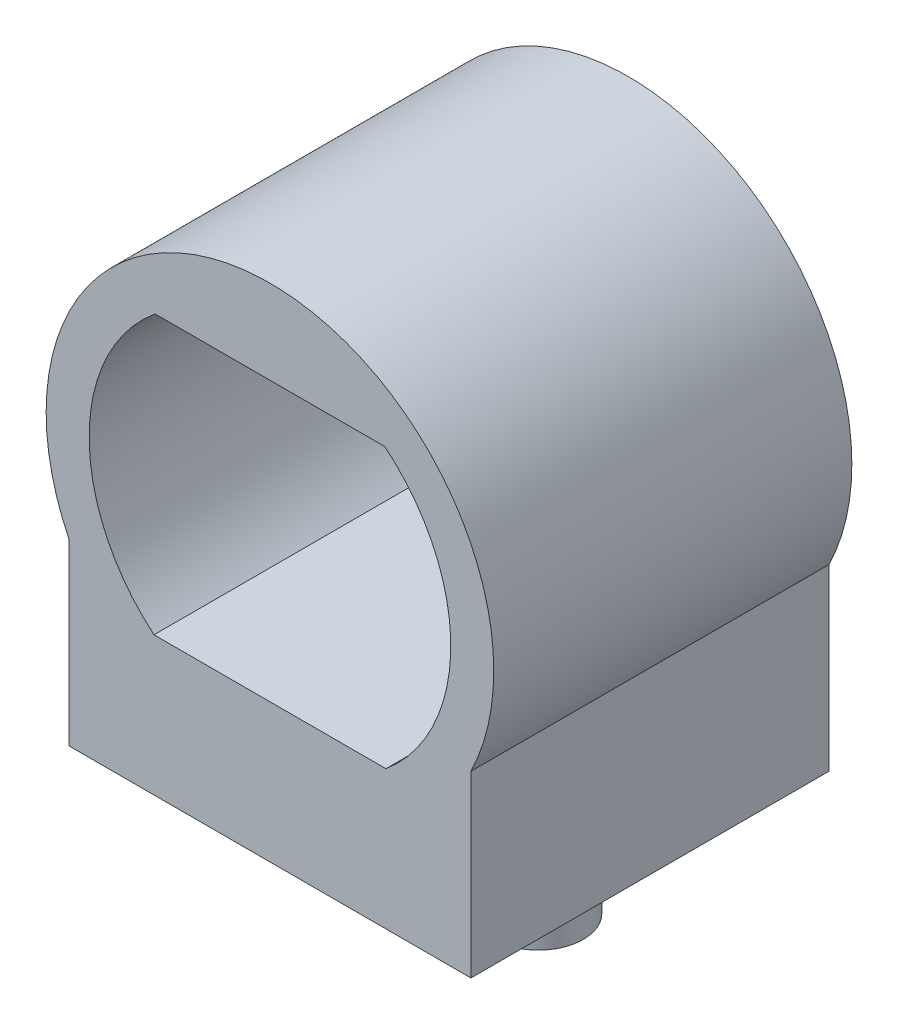
ISO-10303-21;
HEADER;
FILE_DESCRIPTION(('STEP AP214'),'2;1');
FILE_NAME('part.step','',(''),(''),'','','');
FILE_SCHEMA(('AUTOMOTIVE_DESIGN { 1 0 10303 214 1 1 1 1 }'));
ENDSEC;
DATA;
#1=APPLICATION_CONTEXT('core data for automotive mechanical design processes');
#2=APPLICATION_PROTOCOL_DEFINITION('international standard','automotive_design',2000,#1);
#3=PRODUCT_CONTEXT('',#1,'mechanical');
#4=PRODUCT('Part','Part','',(#3));
#5=PRODUCT_RELATED_PRODUCT_CATEGORY('part','',(#4));
#6=PRODUCT_DEFINITION_FORMATION('','',#4);
#7=PRODUCT_DEFINITION_CONTEXT('part definition',#1,'design');
#8=PRODUCT_DEFINITION('design','',#6,#7);
#9=PRODUCT_DEFINITION_SHAPE('','',#8);
#10=(LENGTH_UNIT() NAMED_UNIT(*) SI_UNIT(.MILLI.,.METRE.));
#11=(NAMED_UNIT(*) PLANE_ANGLE_UNIT() SI_UNIT($,.RADIAN.));
#12=(NAMED_UNIT(*) SI_UNIT($,.STERADIAN.) SOLID_ANGLE_UNIT());
#13=UNCERTAINTY_MEASURE_WITH_UNIT(LENGTH_MEASURE(1.E-05),#10,'distance_accuracy_value','');
#14=(GEOMETRIC_REPRESENTATION_CONTEXT(3) GLOBAL_UNCERTAINTY_ASSIGNED_CONTEXT((#13)) GLOBAL_UNIT_ASSIGNED_CONTEXT((#10,
#11,#12)) REPRESENTATION_CONTEXT('',''));
#15=CARTESIAN_POINT('',(0.,0.,0.));
#16=DIRECTION('',(0.,0.,1.));
#17=DIRECTION('',(1.,0.,0.));
#18=AXIS2_PLACEMENT_3D('',#15,#16,#17);
#19=CARTESIAN_POINT('',(0.,0.,0.));
#20=DIRECTION('',(0.,0.,1.));
#21=DIRECTION('',(1.,0.,0.));
#22=AXIS2_PLACEMENT_3D('',#19,#20,#21);
#23=PLANE('',#22);
#24=CARTESIAN_POINT('',(0.,0.,0.));
#25=DIRECTION('',(0.,0.,1.));
#26=DIRECTION('',(1.,0.,0.));
#27=AXIS2_PLACEMENT_3D('',#24,#25,#26);
#28=CIRCLE('',#27,10.1);
#29=CARTESIAN_POINT('',(6.47668896890996,-7.75,0.));
#30=VERTEX_POINT('',#29);
#31=CARTESIAN_POINT('',(6.41638527521533,7.8,0.));
#32=VERTEX_POINT('',#31);
#33=EDGE_CURVE('E67',#30,#32,#28,.T.);
#34=ORIENTED_EDGE('',*,*,#33,.F.);
#35=DIRECTION('',(1.,0.,0.));
#36=VECTOR('',#35,1.);
#37=CARTESIAN_POINT('',(0.,-7.75,0.));
#38=LINE('',#37,#36);
#39=CARTESIAN_POINT('',(-6.47668896890996,-7.75,0.));
#40=VERTEX_POINT('',#39);
#41=EDGE_CURVE('E125',#40,#30,#38,.T.);
#42=ORIENTED_EDGE('',*,*,#41,.F.);
#43=CARTESIAN_POINT('',(-6.41638527521533,7.8,0.));
#44=VERTEX_POINT('',#43);
#45=EDGE_CURVE('E145',#44,#40,#28,.T.);
#46=ORIENTED_EDGE('',*,*,#45,.F.);
#47=DIRECTION('',(-1.,0.,0.));
#48=VECTOR('',#47,1.);
#49=CARTESIAN_POINT('',(0.,7.8,0.));
#50=LINE('',#49,#48);
#51=EDGE_CURVE('E143',#32,#44,#50,.T.);
#52=ORIENTED_EDGE('',*,*,#51,.F.);
#53=EDGE_LOOP('',(#34,#42,#46,#52));
#54=FACE_BOUND('',#53,.T.);
#55=CARTESIAN_POINT('',(0.,0.,0.));
#56=DIRECTION('',(0.,0.,1.));
#57=DIRECTION('',(1.,0.,0.));
#58=AXIS2_PLACEMENT_3D('',#55,#56,#57);
#59=CIRCLE('',#58,12.5);
#60=CARTESIAN_POINT('',(11.2249721603218,-5.5,0.));
#61=VERTEX_POINT('',#60);
#62=CARTESIAN_POINT('',(-11.2249721603218,-5.5,0.));
#63=VERTEX_POINT('',#62);
#64=EDGE_CURVE('E132',#61,#63,#59,.T.);
#65=ORIENTED_EDGE('',*,*,#64,.T.);
#66=DIRECTION('',(0.,-1.,0.));
#67=VECTOR('',#66,1.);
#68=CARTESIAN_POINT('',(-11.2249721603218,0.,0.));
#69=LINE('',#68,#67);
#70=CARTESIAN_POINT('',(-11.2249721603218,-15.5,0.));
#71=VERTEX_POINT('',#70);
#72=EDGE_CURVE('E180',#63,#71,#69,.T.);
#73=ORIENTED_EDGE('',*,*,#72,.T.);
#74=DIRECTION('',(1.,0.,0.));
#75=VECTOR('',#74,1.);
#76=CARTESIAN_POINT('',(0.,-15.5,0.));
#77=LINE('',#76,#75);
#78=CARTESIAN_POINT('',(11.2249721603218,-15.5,0.));
#79=VERTEX_POINT('',#78);
#80=EDGE_CURVE('E184',#71,#79,#77,.T.);
#81=ORIENTED_EDGE('',*,*,#80,.T.);
#82=DIRECTION('',(0.,-1.,0.));
#83=VECTOR('',#82,1.);
#84=CARTESIAN_POINT('',(11.2249721603218,0.,0.));
#85=LINE('',#84,#83);
#86=EDGE_CURVE('E166',#61,#79,#85,.T.);
#87=ORIENTED_EDGE('',*,*,#86,.F.);
#88=EDGE_LOOP('',(#65,#73,#81,#87));
#89=FACE_BOUND('',#88,.T.);
#90=ADVANCED_FACE('F49',(#54,#89),#23,.T.);
#91=CARTESIAN_POINT('',(0.,0.,-20.));
#92=DIRECTION('',(0.,0.,1.));
#93=DIRECTION('',(1.,0.,0.));
#94=AXIS2_PLACEMENT_3D('',#91,#92,#93);
#95=CYLINDRICAL_SURFACE('',#94,12.5);
#96=ORIENTED_EDGE('',*,*,#64,.F.);
#97=DIRECTION('',(0.,0.,1.));
#98=VECTOR('',#97,1.);
#99=CARTESIAN_POINT('',(11.2249721603218,-5.5,-20.));
#100=LINE('',#99,#98);
#101=CARTESIAN_POINT('',(11.2249721603218,-5.5,-20.));
#102=VERTEX_POINT('',#101);
#103=EDGE_CURVE('E11',#102,#61,#100,.T.);
#104=ORIENTED_EDGE('',*,*,#103,.F.);
#105=CARTESIAN_POINT('',(0.,0.,-20.));
#106=DIRECTION('',(0.,0.,1.));
#107=DIRECTION('',(1.,0.,0.));
#108=AXIS2_PLACEMENT_3D('',#105,#106,#107);
#109=CIRCLE('',#108,12.5);
#110=CARTESIAN_POINT('',(-11.2249721603218,-5.5,-20.));
#111=VERTEX_POINT('',#110);
#112=EDGE_CURVE('E161',#102,#111,#109,.T.);
#113=ORIENTED_EDGE('',*,*,#112,.T.);
#114=DIRECTION('',(0.,0.,1.));
#115=VECTOR('',#114,1.);
#116=CARTESIAN_POINT('',(-11.2249721603218,-5.5,-20.));
#117=LINE('',#116,#115);
#118=EDGE_CURVE('E53',#111,#63,#117,.T.);
#119=ORIENTED_EDGE('',*,*,#118,.T.);
#120=EDGE_LOOP('',(#96,#104,#113,#119));
#121=FACE_BOUND('',#120,.T.);
#122=ADVANCED_FACE('F51',(#121),#95,.T.);
#123=CARTESIAN_POINT('',(11.2249721603218,0.,-20.));
#124=DIRECTION('',(-1.,0.,0.));
#125=DIRECTION('',(0.,-1.,0.));
#126=AXIS2_PLACEMENT_3D('',#123,#124,#125);
#127=PLANE('',#126);
#128=ORIENTED_EDGE('',*,*,#86,.T.);
#129=DIRECTION('',(0.,0.,1.));
#130=VECTOR('',#129,1.);
#131=CARTESIAN_POINT('',(11.2249721603218,-15.5,-20.));
#132=LINE('',#131,#130);
#133=CARTESIAN_POINT('',(11.2249721603218,-15.5,-20.));
#134=VERTEX_POINT('',#133);
#135=EDGE_CURVE('E59',#134,#79,#132,.T.);
#136=ORIENTED_EDGE('',*,*,#135,.F.);
#137=DIRECTION('',(0.,-1.,0.));
#138=VECTOR('',#137,1.);
#139=CARTESIAN_POINT('',(11.2249721603218,0.,-20.));
#140=LINE('',#139,#138);
#141=EDGE_CURVE('E174',#102,#134,#140,.T.);
#142=ORIENTED_EDGE('',*,*,#141,.F.);
#143=ORIENTED_EDGE('',*,*,#103,.T.);
#144=EDGE_LOOP('',(#128,#136,#142,#143));
#145=FACE_BOUND('',#144,.T.);
#146=ADVANCED_FACE('F207',(#145),#127,.F.);
#147=CARTESIAN_POINT('',(0.,-15.5,-20.));
#148=DIRECTION('',(0.,-1.,0.));
#149=DIRECTION('',(0.,0.,-1.));
#150=AXIS2_PLACEMENT_3D('',#147,#148,#149);
#151=PLANE('',#150);
#152=CARTESIAN_POINT('',(5.,-15.5,-10.));
#153=DIRECTION('',(0.,-1.,0.));
#154=DIRECTION('',(0.,0.,1.));
#155=AXIS2_PLACEMENT_3D('',#152,#153,#154);
#156=CIRCLE('',#155,2.5);
#157=CARTESIAN_POINT('',(5.,-15.5,-7.5));
#158=VERTEX_POINT('',#157);
#159=EDGE_CURVE('E262',#158,#158,#156,.T.);
#160=ORIENTED_EDGE('',*,*,#159,.F.);
#161=EDGE_LOOP('',(#160));
#162=FACE_BOUND('',#161,.T.);
#163=CARTESIAN_POINT('',(-5.,-15.5,-10.));
#164=DIRECTION('',(0.,-1.,0.));
#165=DIRECTION('',(0.,0.,-1.));
#166=AXIS2_PLACEMENT_3D('',#163,#164,#165);
#167=CIRCLE('',#166,2.5);
#168=CARTESIAN_POINT('',(-5.,-15.5,-12.5));
#169=VERTEX_POINT('',#168);
#170=EDGE_CURVE('E264',#169,#169,#167,.T.);
#171=ORIENTED_EDGE('',*,*,#170,.F.);
#172=EDGE_LOOP('',(#171));
#173=FACE_BOUND('',#172,.T.);
#174=ORIENTED_EDGE('',*,*,#80,.F.);
#175=DIRECTION('',(0.,0.,1.));
#176=VECTOR('',#175,1.);
#177=CARTESIAN_POINT('',(-11.2249721603218,-15.5,-20.));
#178=LINE('',#177,#176);
#179=CARTESIAN_POINT('',(-11.2249721603218,-15.5,-20.));
#180=VERTEX_POINT('',#179);
#181=EDGE_CURVE('E192',#180,#71,#178,.T.);
#182=ORIENTED_EDGE('',*,*,#181,.F.);
#183=DIRECTION('',(1.,0.,0.));
#184=VECTOR('',#183,1.);
#185=CARTESIAN_POINT('',(0.,-15.5,-20.));
#186=LINE('',#185,#184);
#187=EDGE_CURVE('E170',#180,#134,#186,.T.);
#188=ORIENTED_EDGE('',*,*,#187,.T.);
#189=ORIENTED_EDGE('',*,*,#135,.T.);
#190=EDGE_LOOP('',(#174,#182,#188,#189));
#191=FACE_BOUND('',#190,.T.);
#192=ADVANCED_FACE('F211',(#162,#173,#191),#151,.T.);
#193=CARTESIAN_POINT('',(-11.2249721603218,0.,-20.));
#194=DIRECTION('',(-1.,0.,0.));
#195=DIRECTION('',(0.,-1.,0.));
#196=AXIS2_PLACEMENT_3D('',#193,#194,#195);
#197=PLANE('',#196);
#198=ORIENTED_EDGE('',*,*,#72,.F.);
#199=ORIENTED_EDGE('',*,*,#118,.F.);
#200=DIRECTION('',(0.,-1.,0.));
#201=VECTOR('',#200,1.);
#202=CARTESIAN_POINT('',(-11.2249721603218,0.,-20.));
#203=LINE('',#202,#201);
#204=EDGE_CURVE('E165',#111,#180,#203,.T.);
#205=ORIENTED_EDGE('',*,*,#204,.T.);
#206=ORIENTED_EDGE('',*,*,#181,.T.);
#207=EDGE_LOOP('',(#198,#199,#205,#206));
#208=FACE_BOUND('',#207,.T.);
#209=ADVANCED_FACE('F202',(#208),#197,.T.);
#210=CARTESIAN_POINT('',(0.,0.,-20.));
#211=DIRECTION('',(0.,0.,1.));
#212=DIRECTION('',(1.,0.,0.));
#213=AXIS2_PLACEMENT_3D('',#210,#211,#212);
#214=PLANE('',#213);
#215=DIRECTION('',(-1.,0.,0.));
#216=VECTOR('',#215,1.);
#217=CARTESIAN_POINT('',(0.,-7.75,-20.));
#218=LINE('',#217,#216);
#219=CARTESIAN_POINT('',(6.47668896890996,-7.75,-20.));
#220=VERTEX_POINT('',#219);
#221=CARTESIAN_POINT('',(-6.47668896890996,-7.75,-20.));
#222=VERTEX_POINT('',#221);
#223=EDGE_CURVE('E138',#220,#222,#218,.T.);
#224=ORIENTED_EDGE('',*,*,#223,.F.);
#225=CARTESIAN_POINT('',(0.,0.,-20.));
#226=DIRECTION('',(0.,0.,1.));
#227=DIRECTION('',(1.,0.,0.));
#228=AXIS2_PLACEMENT_3D('',#225,#226,#227);
#229=CIRCLE('',#228,10.1);
#230=CARTESIAN_POINT('',(6.41638527521533,7.8,-20.));
#231=VERTEX_POINT('',#230);
#232=EDGE_CURVE('E118',#231,#220,#229,.F.);
#233=ORIENTED_EDGE('',*,*,#232,.F.);
#234=DIRECTION('',(1.,0.,0.));
#235=VECTOR('',#234,1.);
#236=CARTESIAN_POINT('',(0.,7.8,-20.));
#237=LINE('',#236,#235);
#238=CARTESIAN_POINT('',(-6.41638527521533,7.8,-20.));
#239=VERTEX_POINT('',#238);
#240=EDGE_CURVE('E128',#239,#231,#237,.T.);
#241=ORIENTED_EDGE('',*,*,#240,.F.);
#242=CARTESIAN_POINT('',(0.,0.,-20.));
#243=DIRECTION('',(0.,0.,1.));
#244=DIRECTION('',(1.,0.,0.));
#245=AXIS2_PLACEMENT_3D('',#242,#243,#244);
#246=CIRCLE('',#245,10.1);
#247=EDGE_CURVE('E75',#222,#239,#246,.F.);
#248=ORIENTED_EDGE('',*,*,#247,.F.);
#249=EDGE_LOOP('',(#224,#233,#241,#248));
#250=FACE_BOUND('',#249,.T.);
#251=ORIENTED_EDGE('',*,*,#112,.F.);
#252=ORIENTED_EDGE('',*,*,#141,.T.);
#253=ORIENTED_EDGE('',*,*,#187,.F.);
#254=ORIENTED_EDGE('',*,*,#204,.F.);
#255=EDGE_LOOP('',(#251,#252,#253,#254));
#256=FACE_BOUND('',#255,.T.);
#257=ADVANCED_FACE('F135',(#250,#256),#214,.F.);
#258=CARTESIAN_POINT('',(0.,0.,-20.0940986764331));
#259=DIRECTION('',(0.,0.,1.));
#260=DIRECTION('',(1.,0.,0.));
#261=AXIS2_PLACEMENT_3D('',#258,#259,#260);
#262=CYLINDRICAL_SURFACE('',#261,10.1);
#263=ORIENTED_EDGE('',*,*,#232,.T.);
#264=DIRECTION('',(0.,0.,1.));
#265=VECTOR('',#264,1.);
#266=CARTESIAN_POINT('',(6.47668896890996,-7.75,-20.0940986764331));
#267=LINE('',#266,#265);
#268=EDGE_CURVE('E133',#220,#30,#267,.T.);
#269=ORIENTED_EDGE('',*,*,#268,.T.);
#270=ORIENTED_EDGE('',*,*,#33,.T.);
#271=DIRECTION('',(0.,0.,1.));
#272=VECTOR('',#271,1.);
#273=CARTESIAN_POINT('',(6.41638527521533,7.8,-20.0940986764331));
#274=LINE('',#273,#272);
#275=EDGE_CURVE('E114',#231,#32,#274,.T.);
#276=ORIENTED_EDGE('',*,*,#275,.F.);
#277=EDGE_LOOP('',(#263,#269,#270,#276));
#278=FACE_BOUND('',#277,.T.);
#279=ADVANCED_FACE('F116',(#278),#262,.F.);
#280=CARTESIAN_POINT('',(0.,-7.75,-20.0940986764331));
#281=DIRECTION('',(0.,-1.,0.));
#282=DIRECTION('',(0.,0.,-1.));
#283=AXIS2_PLACEMENT_3D('',#280,#281,#282);
#284=PLANE('',#283);
#285=ORIENTED_EDGE('',*,*,#223,.T.);
#286=DIRECTION('',(0.,0.,1.));
#287=VECTOR('',#286,1.);
#288=CARTESIAN_POINT('',(-6.47668896890996,-7.75,-20.0940986764331));
#289=LINE('',#288,#287);
#290=EDGE_CURVE('E156',#222,#40,#289,.T.);
#291=ORIENTED_EDGE('',*,*,#290,.T.);
#292=ORIENTED_EDGE('',*,*,#41,.T.);
#293=ORIENTED_EDGE('',*,*,#268,.F.);
#294=EDGE_LOOP('',(#285,#291,#292,#293));
#295=FACE_BOUND('',#294,.T.);
#296=ADVANCED_FACE('F238',(#295),#284,.F.);
#297=ORIENTED_EDGE('',*,*,#247,.T.);
#298=DIRECTION('',(0.,0.,1.));
#299=VECTOR('',#298,1.);
#300=CARTESIAN_POINT('',(-6.41638527521533,7.8,-20.0940986764331));
#301=LINE('',#300,#299);
#302=EDGE_CURVE('E124',#239,#44,#301,.T.);
#303=ORIENTED_EDGE('',*,*,#302,.T.);
#304=ORIENTED_EDGE('',*,*,#45,.T.);
#305=ORIENTED_EDGE('',*,*,#290,.F.);
#306=EDGE_LOOP('',(#297,#303,#304,#305));
#307=FACE_BOUND('',#306,.T.);
#308=ADVANCED_FACE('F235',(#307),#262,.F.);
#309=CARTESIAN_POINT('',(0.,7.8,-20.0940986764331));
#310=DIRECTION('',(0.,1.,0.));
#311=DIRECTION('',(0.,0.,1.));
#312=AXIS2_PLACEMENT_3D('',#309,#310,#311);
#313=PLANE('',#312);
#314=ORIENTED_EDGE('',*,*,#240,.T.);
#315=ORIENTED_EDGE('',*,*,#275,.T.);
#316=ORIENTED_EDGE('',*,*,#51,.T.);
#317=ORIENTED_EDGE('',*,*,#302,.F.);
#318=EDGE_LOOP('',(#314,#315,#316,#317));
#319=FACE_BOUND('',#318,.T.);
#320=ADVANCED_FACE('F129',(#319),#313,.F.);
#321=CARTESIAN_POINT('',(-5.,-20.5,-10.));
#322=DIRECTION('',(0.,1.,0.));
#323=DIRECTION('',(0.,0.,1.));
#324=AXIS2_PLACEMENT_3D('',#321,#322,#323);
#325=CYLINDRICAL_SURFACE('',#324,2.5);
#326=CARTESIAN_POINT('',(-5.,-20.5,-10.));
#327=DIRECTION('',(0.,-1.,0.));
#328=DIRECTION('',(0.,0.,-1.));
#329=AXIS2_PLACEMENT_3D('',#326,#327,#328);
#330=CIRCLE('',#329,2.5);
#331=CARTESIAN_POINT('',(-5.,-20.5,-12.5));
#332=VERTEX_POINT('',#331);
#333=EDGE_CURVE('E269',#332,#332,#330,.T.);
#334=ORIENTED_EDGE('',*,*,#333,.F.);
#335=EDGE_LOOP('',(#334));
#336=FACE_BOUND('',#335,.T.);
#337=ORIENTED_EDGE('',*,*,#170,.T.);
#338=EDGE_LOOP('',(#337));
#339=FACE_BOUND('',#338,.T.);
#340=ADVANCED_FACE('F234',(#336,#339),#325,.T.);
#341=CARTESIAN_POINT('',(-5.,-20.5,-10.));
#342=DIRECTION('',(0.,-1.,0.));
#343=DIRECTION('',(0.,0.,-1.));
#344=AXIS2_PLACEMENT_3D('',#341,#342,#343);
#345=PLANE('',#344);
#346=ORIENTED_EDGE('',*,*,#333,.T.);
#347=EDGE_LOOP('',(#346));
#348=FACE_BOUND('',#347,.T.);
#349=ADVANCED_FACE('F243',(#348),#345,.T.);
#350=CARTESIAN_POINT('',(5.,-20.5,-10.));
#351=DIRECTION('',(0.,1.,0.));
#352=DIRECTION('',(0.,0.,1.));
#353=AXIS2_PLACEMENT_3D('',#350,#351,#352);
#354=CYLINDRICAL_SURFACE('',#353,2.5);
#355=CARTESIAN_POINT('',(5.,-20.5,-10.));
#356=DIRECTION('',(0.,-1.,0.));
#357=DIRECTION('',(0.,0.,1.));
#358=AXIS2_PLACEMENT_3D('',#355,#356,#357);
#359=CIRCLE('',#358,2.5);
#360=CARTESIAN_POINT('',(5.,-20.5,-7.5));
#361=VERTEX_POINT('',#360);
#362=EDGE_CURVE('E260',#361,#361,#359,.T.);
#363=ORIENTED_EDGE('',*,*,#362,.F.);
#364=EDGE_LOOP('',(#363));
#365=FACE_BOUND('',#364,.T.);
#366=ORIENTED_EDGE('',*,*,#159,.T.);
#367=EDGE_LOOP('',(#366));
#368=FACE_BOUND('',#367,.T.);
#369=ADVANCED_FACE('F247',(#365,#368),#354,.T.);
#370=CARTESIAN_POINT('',(5.,-20.5,-10.));
#371=DIRECTION('',(0.,1.,0.));
#372=DIRECTION('',(0.,0.,1.));
#373=AXIS2_PLACEMENT_3D('',#370,#371,#372);
#374=PLANE('',#373);
#375=ORIENTED_EDGE('',*,*,#362,.T.);
#376=EDGE_LOOP('',(#375));
#377=FACE_BOUND('',#376,.T.);
#378=ADVANCED_FACE('F249',(#377),#374,.F.);
#379=CLOSED_SHELL('',(#90,#122,#146,#192,#209,#257,#279,#296,#308,#320,#340,#349,#369,#378));
#380=MANIFOLD_SOLID_BREP('B2',#379);
#381=ADVANCED_BREP_SHAPE_REPRESENTATION('',(#18,#380),#14);
#382=SHAPE_DEFINITION_REPRESENTATION(#9,#381);
ENDSEC;
END-ISO-10303-21;
